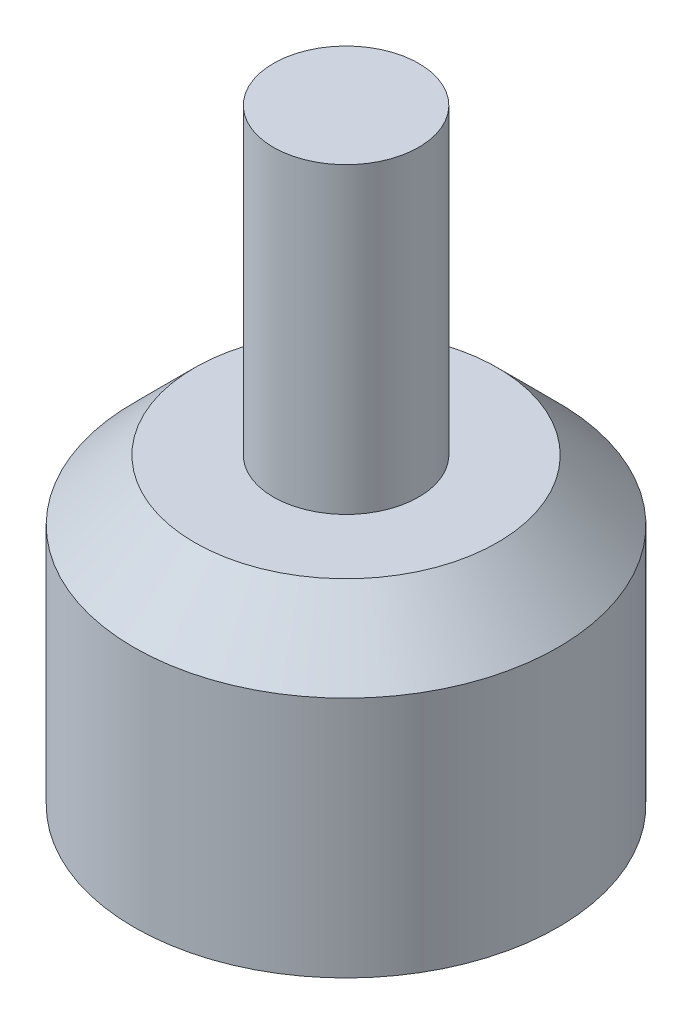
ISO-10303-21;
HEADER;
FILE_DESCRIPTION(('STEP AP214'),'2;1');
FILE_NAME('part.step','',(''),(''),'','','');
FILE_SCHEMA(('AUTOMOTIVE_DESIGN { 1 0 10303 214 1 1 1 1 }'));
ENDSEC;
DATA;
#1=APPLICATION_CONTEXT('core data for automotive mechanical design processes');
#2=APPLICATION_PROTOCOL_DEFINITION('international standard','automotive_design',2000,#1);
#3=PRODUCT_CONTEXT('',#1,'mechanical');
#4=PRODUCT('Part','Part','',(#3));
#5=PRODUCT_RELATED_PRODUCT_CATEGORY('part','',(#4));
#6=PRODUCT_DEFINITION_FORMATION('','',#4);
#7=PRODUCT_DEFINITION_CONTEXT('part definition',#1,'design');
#8=PRODUCT_DEFINITION('design','',#6,#7);
#9=PRODUCT_DEFINITION_SHAPE('','',#8);
#10=(LENGTH_UNIT() NAMED_UNIT(*) SI_UNIT(.MILLI.,.METRE.));
#11=(NAMED_UNIT(*) PLANE_ANGLE_UNIT() SI_UNIT($,.RADIAN.));
#12=(NAMED_UNIT(*) SI_UNIT($,.STERADIAN.) SOLID_ANGLE_UNIT());
#13=UNCERTAINTY_MEASURE_WITH_UNIT(LENGTH_MEASURE(1.E-05),#10,'distance_accuracy_value','');
#14=(GEOMETRIC_REPRESENTATION_CONTEXT(3) GLOBAL_UNCERTAINTY_ASSIGNED_CONTEXT((#13)) GLOBAL_UNIT_ASSIGNED_CONTEXT((#10,
#11,#12)) REPRESENTATION_CONTEXT('',''));
#15=CARTESIAN_POINT('',(0.,0.,0.));
#16=DIRECTION('',(0.,0.,1.));
#17=DIRECTION('',(1.,0.,0.));
#18=AXIS2_PLACEMENT_3D('',#15,#16,#17);
#19=CARTESIAN_POINT('',(0.,10.,0.));
#20=DIRECTION('',(0.,-1.,0.));
#21=DIRECTION('',(0.,0.,-1.));
#22=AXIS2_PLACEMENT_3D('',#19,#20,#21);
#23=CYLINDRICAL_SURFACE('',#22,7.);
#24=CARTESIAN_POINT('',(0.,7.99999999999999,0.));
#25=DIRECTION('',(0.,1.,0.));
#26=DIRECTION('',(0.,0.,1.));
#27=AXIS2_PLACEMENT_3D('',#24,#25,#26);
#28=CIRCLE('',#27,7.);
#29=CARTESIAN_POINT('',(0.,7.99999999999999,7.));
#30=VERTEX_POINT('',#29);
#31=EDGE_CURVE('E34',#30,#30,#28,.F.);
#32=ORIENTED_EDGE('',*,*,#31,.T.);
#33=EDGE_LOOP('',(#32));
#34=FACE_BOUND('',#33,.T.);
#35=CARTESIAN_POINT('',(0.,0.,0.));
#36=DIRECTION('',(0.,1.,0.));
#37=DIRECTION('',(0.,0.,1.));
#38=AXIS2_PLACEMENT_3D('',#35,#36,#37);
#39=CIRCLE('',#38,7.);
#40=CARTESIAN_POINT('',(0.,0.,7.));
#41=VERTEX_POINT('',#40);
#42=EDGE_CURVE('E46',#41,#41,#39,.T.);
#43=ORIENTED_EDGE('',*,*,#42,.T.);
#44=EDGE_LOOP('',(#43));
#45=FACE_BOUND('',#44,.T.);
#46=ADVANCED_FACE('F30',(#34,#45),#23,.T.);
#47=CARTESIAN_POINT('',(0.,10.,0.));
#48=DIRECTION('',(0.,1.,0.));
#49=DIRECTION('',(0.,0.,1.));
#50=AXIS2_PLACEMENT_3D('',#47,#48,#49);
#51=PLANE('',#50);
#52=CARTESIAN_POINT('',(0.,10.,0.));
#53=DIRECTION('',(0.,1.,0.));
#54=DIRECTION('',(0.,0.,1.));
#55=AXIS2_PLACEMENT_3D('',#52,#53,#54);
#56=CIRCLE('',#55,2.4);
#57=CARTESIAN_POINT('',(0.,10.,2.4));
#58=VERTEX_POINT('',#57);
#59=EDGE_CURVE('E10',#58,#58,#56,.T.);
#60=ORIENTED_EDGE('',*,*,#59,.F.);
#61=EDGE_LOOP('',(#60));
#62=FACE_BOUND('',#61,.T.);
#63=CARTESIAN_POINT('',(0.,10.,0.));
#64=DIRECTION('',(0.,1.,0.));
#65=DIRECTION('',(0.,0.,1.));
#66=AXIS2_PLACEMENT_3D('',#63,#64,#65);
#67=CIRCLE('',#66,5.);
#68=CARTESIAN_POINT('',(0.,10.,5.));
#69=VERTEX_POINT('',#68);
#70=EDGE_CURVE('E42',#69,#69,#67,.T.);
#71=ORIENTED_EDGE('',*,*,#70,.T.);
#72=EDGE_LOOP('',(#71));
#73=FACE_BOUND('',#72,.T.);
#74=ADVANCED_FACE('F51',(#62,#73),#51,.T.);
#75=CARTESIAN_POINT('',(0.,0.,0.));
#76=DIRECTION('',(0.,1.,0.));
#77=DIRECTION('',(0.,0.,1.));
#78=AXIS2_PLACEMENT_3D('',#75,#76,#77);
#79=PLANE('',#78);
#80=ORIENTED_EDGE('',*,*,#42,.F.);
#81=EDGE_LOOP('',(#80));
#82=FACE_BOUND('',#81,.T.);
#83=ADVANCED_FACE('F55',(#82),#79,.F.);
#84=CARTESIAN_POINT('',(0.,10.,0.));
#85=DIRECTION('',(0.,-1.,0.));
#86=DIRECTION('',(0.,0.,-1.));
#87=AXIS2_PLACEMENT_3D('',#84,#85,#86);
#88=CONICAL_SURFACE('',#87,5.,0.785398163397446);
#89=ORIENTED_EDGE('',*,*,#31,.F.);
#90=EDGE_LOOP('',(#89));
#91=FACE_BOUND('',#90,.T.);
#92=ORIENTED_EDGE('',*,*,#70,.F.);
#93=EDGE_LOOP('',(#92));
#94=FACE_BOUND('',#93,.T.);
#95=ADVANCED_FACE('F32',(#91,#94),#88,.T.);
#96=CARTESIAN_POINT('',(0.,20.,0.));
#97=DIRECTION('',(0.,-1.,0.));
#98=DIRECTION('',(0.,0.,-1.));
#99=AXIS2_PLACEMENT_3D('',#96,#97,#98);
#100=CYLINDRICAL_SURFACE('',#99,2.4);
#101=CARTESIAN_POINT('',(0.,20.,0.));
#102=DIRECTION('',(0.,1.,0.));
#103=DIRECTION('',(0.,0.,1.));
#104=AXIS2_PLACEMENT_3D('',#101,#102,#103);
#105=CIRCLE('',#104,2.4);
#106=CARTESIAN_POINT('',(0.,20.,2.4));
#107=VERTEX_POINT('',#106);
#108=EDGE_CURVE('E45',#107,#107,#105,.T.);
#109=ORIENTED_EDGE('',*,*,#108,.F.);
#110=EDGE_LOOP('',(#109));
#111=FACE_BOUND('',#110,.T.);
#112=ORIENTED_EDGE('',*,*,#59,.T.);
#113=EDGE_LOOP('',(#112));
#114=FACE_BOUND('',#113,.T.);
#115=ADVANCED_FACE('F54',(#111,#114),#100,.T.);
#116=CARTESIAN_POINT('',(0.,20.,0.));
#117=DIRECTION('',(0.,1.,0.));
#118=DIRECTION('',(0.,0.,1.));
#119=AXIS2_PLACEMENT_3D('',#116,#117,#118);
#120=PLANE('',#119);
#121=ORIENTED_EDGE('',*,*,#108,.T.);
#122=EDGE_LOOP('',(#121));
#123=FACE_BOUND('',#122,.T.);
#124=ADVANCED_FACE('F61',(#123),#120,.T.);
#125=CLOSED_SHELL('',(#46,#74,#83,#95,#115,#124));
#126=MANIFOLD_SOLID_BREP('B2',#125);
#127=ADVANCED_BREP_SHAPE_REPRESENTATION('',(#18,#126),#14);
#128=SHAPE_DEFINITION_REPRESENTATION(#9,#127);
ENDSEC;
END-ISO-10303-21;
